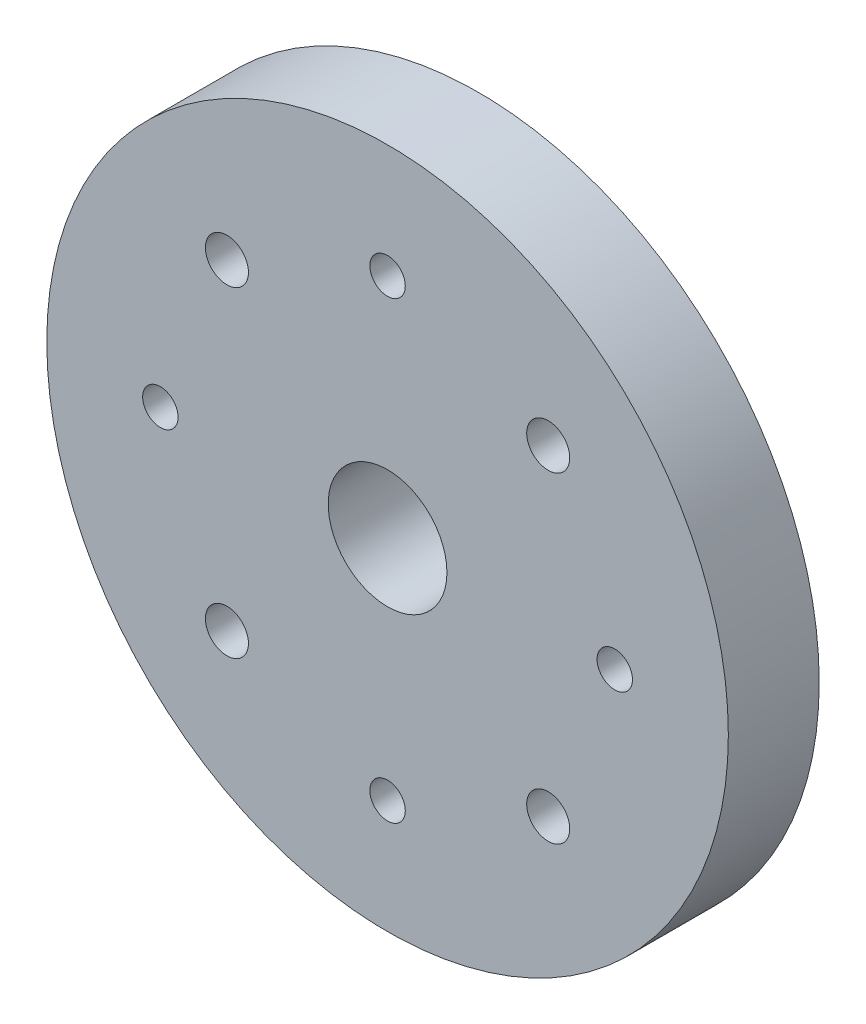
ISO-10303-21;
HEADER;
FILE_DESCRIPTION(('STEP AP214'),'2;1');
FILE_NAME('part.step','',(''),(''),'','','');
FILE_SCHEMA(('AUTOMOTIVE_DESIGN { 1 0 10303 214 1 1 1 1 }'));
ENDSEC;
DATA;
#1=APPLICATION_CONTEXT('core data for automotive mechanical design processes');
#2=APPLICATION_PROTOCOL_DEFINITION('international standard','automotive_design',2000,#1);
#3=PRODUCT_CONTEXT('',#1,'mechanical');
#4=PRODUCT('Part','Part','',(#3));
#5=PRODUCT_RELATED_PRODUCT_CATEGORY('part','',(#4));
#6=PRODUCT_DEFINITION_FORMATION('','',#4);
#7=PRODUCT_DEFINITION_CONTEXT('part definition',#1,'design');
#8=PRODUCT_DEFINITION('design','',#6,#7);
#9=PRODUCT_DEFINITION_SHAPE('','',#8);
#10=(LENGTH_UNIT() NAMED_UNIT(*) SI_UNIT(.MILLI.,.METRE.));
#11=(NAMED_UNIT(*) PLANE_ANGLE_UNIT() SI_UNIT($,.RADIAN.));
#12=(NAMED_UNIT(*) SI_UNIT($,.STERADIAN.) SOLID_ANGLE_UNIT());
#13=UNCERTAINTY_MEASURE_WITH_UNIT(LENGTH_MEASURE(1.E-05),#10,'distance_accuracy_value','');
#14=(GEOMETRIC_REPRESENTATION_CONTEXT(3) GLOBAL_UNCERTAINTY_ASSIGNED_CONTEXT((#13)) GLOBAL_UNIT_ASSIGNED_CONTEXT((#10,
#11,#12)) REPRESENTATION_CONTEXT('',''));
#15=CARTESIAN_POINT('',(0.,0.,0.));
#16=DIRECTION('',(0.,0.,1.));
#17=DIRECTION('',(1.,0.,0.));
#18=AXIS2_PLACEMENT_3D('',#15,#16,#17);
#19=CARTESIAN_POINT('',(0.,0.,6.));
#20=DIRECTION('',(0.,0.,1.));
#21=DIRECTION('',(1.,0.,0.));
#22=AXIS2_PLACEMENT_3D('',#19,#20,#21);
#23=PLANE('',#22);
#24=CARTESIAN_POINT('',(-15.,1.57116660247941E-13,6.));
#25=DIRECTION('',(0.,0.,1.));
#26=DIRECTION('',(1.,0.,0.));
#27=AXIS2_PLACEMENT_3D('',#24,#25,#26);
#28=CIRCLE('',#27,1.17);
#29=CARTESIAN_POINT('',(-13.83,1.57116660247941E-13,6.));
#30=VERTEX_POINT('',#29);
#31=EDGE_CURVE('E62',#30,#30,#28,.T.);
#32=ORIENTED_EDGE('',*,*,#31,.F.);
#33=EDGE_LOOP('',(#32));
#34=FACE_BOUND('',#33,.T.);
#35=CARTESIAN_POINT('',(3.48781665394082E-13,-15.0000000000002,6.));
#36=DIRECTION('',(0.,0.,1.));
#37=DIRECTION('',(1.,0.,0.));
#38=AXIS2_PLACEMENT_3D('',#35,#36,#37);
#39=CIRCLE('',#38,1.17);
#40=CARTESIAN_POINT('',(1.17000000000035,-15.0000000000002,6.));
#41=VERTEX_POINT('',#40);
#42=EDGE_CURVE('E74',#41,#41,#39,.T.);
#43=ORIENTED_EDGE('',*,*,#42,.F.);
#44=EDGE_LOOP('',(#43));
#45=FACE_BOUND('',#44,.T.);
#46=CARTESIAN_POINT('',(15.,0.,6.));
#47=DIRECTION('',(0.,0.,1.));
#48=DIRECTION('',(1.,0.,0.));
#49=AXIS2_PLACEMENT_3D('',#46,#47,#48);
#50=CIRCLE('',#49,1.17);
#51=CARTESIAN_POINT('',(16.17,0.,6.));
#52=VERTEX_POINT('',#51);
#53=EDGE_CURVE('E86',#52,#52,#50,.T.);
#54=ORIENTED_EDGE('',*,*,#53,.F.);
#55=EDGE_LOOP('',(#54));
#56=FACE_BOUND('',#55,.T.);
#57=CARTESIAN_POINT('',(0.,15.,6.));
#58=DIRECTION('',(0.,0.,1.));
#59=DIRECTION('',(1.,0.,0.));
#60=AXIS2_PLACEMENT_3D('',#57,#58,#59);
#61=CIRCLE('',#60,1.17);
#62=CARTESIAN_POINT('',(1.17,15.,6.));
#63=VERTEX_POINT('',#62);
#64=EDGE_CURVE('E54',#63,#63,#61,.T.);
#65=ORIENTED_EDGE('',*,*,#64,.F.);
#66=EDGE_LOOP('',(#65));
#67=FACE_BOUND('',#66,.T.);
#68=CARTESIAN_POINT('',(0.,0.,6.));
#69=DIRECTION('',(0.,0.,1.));
#70=DIRECTION('',(1.,0.,0.));
#71=AXIS2_PLACEMENT_3D('',#68,#69,#70);
#72=CIRCLE('',#71,22.5);
#73=CARTESIAN_POINT('',(22.5,0.,6.));
#74=VERTEX_POINT('',#73);
#75=EDGE_CURVE('E11',#74,#74,#72,.T.);
#76=ORIENTED_EDGE('',*,*,#75,.T.);
#77=EDGE_LOOP('',(#76));
#78=FACE_BOUND('',#77,.T.);
#79=CARTESIAN_POINT('',(0.,0.,6.));
#80=DIRECTION('',(0.,0.,1.));
#81=DIRECTION('',(1.,0.,0.));
#82=AXIS2_PLACEMENT_3D('',#79,#80,#81);
#83=CIRCLE('',#82,3.92);
#84=CARTESIAN_POINT('',(3.92,0.,6.));
#85=VERTEX_POINT('',#84);
#86=EDGE_CURVE('E46',#85,#85,#83,.T.);
#87=ORIENTED_EDGE('',*,*,#86,.F.);
#88=EDGE_LOOP('',(#87));
#89=FACE_BOUND('',#88,.T.);
#90=CARTESIAN_POINT('',(10.6066017177982,10.6066017177982,6.));
#91=DIRECTION('',(0.,0.,1.));
#92=DIRECTION('',(1.,0.,0.));
#93=AXIS2_PLACEMENT_3D('',#90,#91,#92);
#94=CIRCLE('',#93,1.42);
#95=CARTESIAN_POINT('',(12.0266017177982,10.6066017177982,6.));
#96=VERTEX_POINT('',#95);
#97=EDGE_CURVE('E92',#96,#96,#94,.T.);
#98=ORIENTED_EDGE('',*,*,#97,.F.);
#99=EDGE_LOOP('',(#98));
#100=FACE_BOUND('',#99,.T.);
#101=CARTESIAN_POINT('',(10.6066017177982,-10.6066017177983,6.));
#102=DIRECTION('',(0.,0.,1.));
#103=DIRECTION('',(1.,0.,0.));
#104=AXIS2_PLACEMENT_3D('',#101,#102,#103);
#105=CIRCLE('',#104,1.42);
#106=CARTESIAN_POINT('',(12.0266017177982,-10.6066017177983,6.));
#107=VERTEX_POINT('',#106);
#108=EDGE_CURVE('E80',#107,#107,#105,.T.);
#109=ORIENTED_EDGE('',*,*,#108,.F.);
#110=EDGE_LOOP('',(#109));
#111=FACE_BOUND('',#110,.T.);
#112=CARTESIAN_POINT('',(-10.6066017177979,-10.6066017177983,6.));
#113=DIRECTION('',(0.,0.,1.));
#114=DIRECTION('',(1.,0.,0.));
#115=AXIS2_PLACEMENT_3D('',#112,#113,#114);
#116=CIRCLE('',#115,1.42);
#117=CARTESIAN_POINT('',(-9.18660171779788,-10.6066017177983,6.));
#118=VERTEX_POINT('',#117);
#119=EDGE_CURVE('E68',#118,#118,#116,.T.);
#120=ORIENTED_EDGE('',*,*,#119,.F.);
#121=EDGE_LOOP('',(#120));
#122=FACE_BOUND('',#121,.T.);
#123=CARTESIAN_POINT('',(-10.6066017177981,10.6066017177983,6.));
#124=DIRECTION('',(0.,0.,1.));
#125=DIRECTION('',(1.,0.,0.));
#126=AXIS2_PLACEMENT_3D('',#123,#124,#125);
#127=CIRCLE('',#126,1.42);
#128=CARTESIAN_POINT('',(-9.18660171779808,10.6066017177983,6.));
#129=VERTEX_POINT('',#128);
#130=EDGE_CURVE('E55',#129,#129,#127,.T.);
#131=ORIENTED_EDGE('',*,*,#130,.F.);
#132=EDGE_LOOP('',(#131));
#133=FACE_BOUND('',#132,.T.);
#134=ADVANCED_FACE('F33',(#34,#45,#56,#67,#78,#89,#100,#111,#122,#133),#23,.T.);
#135=CARTESIAN_POINT('',(0.,0.,0.));
#136=DIRECTION('',(0.,0.,1.));
#137=DIRECTION('',(1.,0.,0.));
#138=AXIS2_PLACEMENT_3D('',#135,#136,#137);
#139=PLANE('',#138);
#140=CARTESIAN_POINT('',(-15.,1.57116660247941E-13,0.));
#141=DIRECTION('',(0.,0.,1.));
#142=DIRECTION('',(1.,0.,0.));
#143=AXIS2_PLACEMENT_3D('',#140,#141,#142);
#144=CIRCLE('',#143,1.17);
#145=CARTESIAN_POINT('',(-13.83,1.57116660247941E-13,0.));
#146=VERTEX_POINT('',#145);
#147=EDGE_CURVE('E58',#146,#146,#144,.T.);
#148=ORIENTED_EDGE('',*,*,#147,.T.);
#149=EDGE_LOOP('',(#148));
#150=FACE_BOUND('',#149,.T.);
#151=CARTESIAN_POINT('',(3.48781665394082E-13,-15.0000000000002,0.));
#152=DIRECTION('',(0.,0.,1.));
#153=DIRECTION('',(1.,0.,0.));
#154=AXIS2_PLACEMENT_3D('',#151,#152,#153);
#155=CIRCLE('',#154,1.17);
#156=CARTESIAN_POINT('',(1.17000000000035,-15.0000000000002,0.));
#157=VERTEX_POINT('',#156);
#158=EDGE_CURVE('E71',#157,#157,#155,.T.);
#159=ORIENTED_EDGE('',*,*,#158,.T.);
#160=EDGE_LOOP('',(#159));
#161=FACE_BOUND('',#160,.T.);
#162=CARTESIAN_POINT('',(15.,0.,0.));
#163=DIRECTION('',(0.,0.,1.));
#164=DIRECTION('',(1.,0.,0.));
#165=AXIS2_PLACEMENT_3D('',#162,#163,#164);
#166=CIRCLE('',#165,1.17);
#167=CARTESIAN_POINT('',(16.17,0.,0.));
#168=VERTEX_POINT('',#167);
#169=EDGE_CURVE('E83',#168,#168,#166,.T.);
#170=ORIENTED_EDGE('',*,*,#169,.T.);
#171=EDGE_LOOP('',(#170));
#172=FACE_BOUND('',#171,.T.);
#173=CARTESIAN_POINT('',(0.,15.,0.));
#174=DIRECTION('',(0.,0.,1.));
#175=DIRECTION('',(1.,0.,0.));
#176=AXIS2_PLACEMENT_3D('',#173,#174,#175);
#177=CIRCLE('',#176,1.17);
#178=CARTESIAN_POINT('',(1.17,15.,0.));
#179=VERTEX_POINT('',#178);
#180=EDGE_CURVE('E37',#179,#179,#177,.T.);
#181=ORIENTED_EDGE('',*,*,#180,.T.);
#182=EDGE_LOOP('',(#181));
#183=FACE_BOUND('',#182,.T.);
#184=CARTESIAN_POINT('',(0.,0.,0.));
#185=DIRECTION('',(0.,0.,1.));
#186=DIRECTION('',(1.,0.,0.));
#187=AXIS2_PLACEMENT_3D('',#184,#185,#186);
#188=CIRCLE('',#187,22.5);
#189=CARTESIAN_POINT('',(22.5,0.,0.));
#190=VERTEX_POINT('',#189);
#191=EDGE_CURVE('E41',#190,#190,#188,.T.);
#192=ORIENTED_EDGE('',*,*,#191,.F.);
#193=EDGE_LOOP('',(#192));
#194=FACE_BOUND('',#193,.T.);
#195=CARTESIAN_POINT('',(0.,0.,0.));
#196=DIRECTION('',(0.,0.,1.));
#197=DIRECTION('',(1.,0.,0.));
#198=AXIS2_PLACEMENT_3D('',#195,#196,#197);
#199=CIRCLE('',#198,3.92);
#200=CARTESIAN_POINT('',(3.92,0.,0.));
#201=VERTEX_POINT('',#200);
#202=EDGE_CURVE('E51',#201,#201,#199,.T.);
#203=ORIENTED_EDGE('',*,*,#202,.T.);
#204=EDGE_LOOP('',(#203));
#205=FACE_BOUND('',#204,.T.);
#206=CARTESIAN_POINT('',(10.6066017177982,10.6066017177982,0.));
#207=DIRECTION('',(0.,0.,1.));
#208=DIRECTION('',(1.,0.,0.));
#209=AXIS2_PLACEMENT_3D('',#206,#207,#208);
#210=CIRCLE('',#209,1.42);
#211=CARTESIAN_POINT('',(12.0266017177982,10.6066017177982,0.));
#212=VERTEX_POINT('',#211);
#213=EDGE_CURVE('E89',#212,#212,#210,.T.);
#214=ORIENTED_EDGE('',*,*,#213,.T.);
#215=EDGE_LOOP('',(#214));
#216=FACE_BOUND('',#215,.T.);
#217=CARTESIAN_POINT('',(10.6066017177982,-10.6066017177983,0.));
#218=DIRECTION('',(0.,0.,1.));
#219=DIRECTION('',(1.,0.,0.));
#220=AXIS2_PLACEMENT_3D('',#217,#218,#219);
#221=CIRCLE('',#220,1.42);
#222=CARTESIAN_POINT('',(12.0266017177982,-10.6066017177983,0.));
#223=VERTEX_POINT('',#222);
#224=EDGE_CURVE('E77',#223,#223,#221,.T.);
#225=ORIENTED_EDGE('',*,*,#224,.T.);
#226=EDGE_LOOP('',(#225));
#227=FACE_BOUND('',#226,.T.);
#228=CARTESIAN_POINT('',(-10.6066017177979,-10.6066017177983,0.));
#229=DIRECTION('',(0.,0.,1.));
#230=DIRECTION('',(1.,0.,0.));
#231=AXIS2_PLACEMENT_3D('',#228,#229,#230);
#232=CIRCLE('',#231,1.42);
#233=CARTESIAN_POINT('',(-9.18660171779788,-10.6066017177983,0.));
#234=VERTEX_POINT('',#233);
#235=EDGE_CURVE('E65',#234,#234,#232,.T.);
#236=ORIENTED_EDGE('',*,*,#235,.T.);
#237=EDGE_LOOP('',(#236));
#238=FACE_BOUND('',#237,.T.);
#239=CARTESIAN_POINT('',(-10.6066017177981,10.6066017177983,0.));
#240=DIRECTION('',(0.,0.,1.));
#241=DIRECTION('',(1.,0.,0.));
#242=AXIS2_PLACEMENT_3D('',#239,#240,#241);
#243=CIRCLE('',#242,1.42);
#244=CARTESIAN_POINT('',(-9.18660171779808,10.6066017177983,0.));
#245=VERTEX_POINT('',#244);
#246=EDGE_CURVE('E59',#245,#245,#243,.T.);
#247=ORIENTED_EDGE('',*,*,#246,.T.);
#248=EDGE_LOOP('',(#247));
#249=FACE_BOUND('',#248,.T.);
#250=ADVANCED_FACE('F102',(#150,#161,#172,#183,#194,#205,#216,#227,#238,#249),#139,.F.);
#251=CARTESIAN_POINT('',(0.,0.,6.));
#252=DIRECTION('',(0.,0.,-1.));
#253=DIRECTION('',(-1.,0.,0.));
#254=AXIS2_PLACEMENT_3D('',#251,#252,#253);
#255=CYLINDRICAL_SURFACE('',#254,22.5);
#256=ORIENTED_EDGE('',*,*,#75,.F.);
#257=EDGE_LOOP('',(#256));
#258=FACE_BOUND('',#257,.T.);
#259=ORIENTED_EDGE('',*,*,#191,.T.);
#260=EDGE_LOOP('',(#259));
#261=FACE_BOUND('',#260,.T.);
#262=ADVANCED_FACE('F117',(#258,#261),#255,.T.);
#263=CARTESIAN_POINT('',(0.,0.,6.));
#264=DIRECTION('',(0.,0.,-1.));
#265=DIRECTION('',(-1.,0.,0.));
#266=AXIS2_PLACEMENT_3D('',#263,#264,#265);
#267=CYLINDRICAL_SURFACE('',#266,3.92);
#268=ORIENTED_EDGE('',*,*,#86,.T.);
#269=EDGE_LOOP('',(#268));
#270=FACE_BOUND('',#269,.T.);
#271=ORIENTED_EDGE('',*,*,#202,.F.);
#272=EDGE_LOOP('',(#271));
#273=FACE_BOUND('',#272,.T.);
#274=ADVANCED_FACE('F108',(#270,#273),#267,.F.);
#275=CARTESIAN_POINT('',(0.,15.,6.));
#276=DIRECTION('',(0.,0.,-1.));
#277=DIRECTION('',(-1.,0.,0.));
#278=AXIS2_PLACEMENT_3D('',#275,#276,#277);
#279=CYLINDRICAL_SURFACE('',#278,1.17);
#280=ORIENTED_EDGE('',*,*,#64,.T.);
#281=EDGE_LOOP('',(#280));
#282=FACE_BOUND('',#281,.T.);
#283=ORIENTED_EDGE('',*,*,#180,.F.);
#284=EDGE_LOOP('',(#283));
#285=FACE_BOUND('',#284,.T.);
#286=ADVANCED_FACE('F105',(#282,#285),#279,.F.);
#287=CARTESIAN_POINT('',(10.6066017177982,10.6066017177982,6.));
#288=DIRECTION('',(0.,0.,-1.));
#289=DIRECTION('',(-1.,0.,0.));
#290=AXIS2_PLACEMENT_3D('',#287,#288,#289);
#291=CYLINDRICAL_SURFACE('',#290,1.42);
#292=ORIENTED_EDGE('',*,*,#97,.T.);
#293=EDGE_LOOP('',(#292));
#294=FACE_BOUND('',#293,.T.);
#295=ORIENTED_EDGE('',*,*,#213,.F.);
#296=EDGE_LOOP('',(#295));
#297=FACE_BOUND('',#296,.T.);
#298=ADVANCED_FACE('F107',(#294,#297),#291,.F.);
#299=CARTESIAN_POINT('',(15.,0.,6.));
#300=DIRECTION('',(0.,0.,-1.));
#301=DIRECTION('',(-1.,0.,0.));
#302=AXIS2_PLACEMENT_3D('',#299,#300,#301);
#303=CYLINDRICAL_SURFACE('',#302,1.17);
#304=ORIENTED_EDGE('',*,*,#53,.T.);
#305=EDGE_LOOP('',(#304));
#306=FACE_BOUND('',#305,.T.);
#307=ORIENTED_EDGE('',*,*,#169,.F.);
#308=EDGE_LOOP('',(#307));
#309=FACE_BOUND('',#308,.T.);
#310=ADVANCED_FACE('F114',(#306,#309),#303,.F.);
#311=CARTESIAN_POINT('',(10.6066017177982,-10.6066017177983,6.));
#312=DIRECTION('',(0.,0.,-1.));
#313=DIRECTION('',(-1.,0.,0.));
#314=AXIS2_PLACEMENT_3D('',#311,#312,#313);
#315=CYLINDRICAL_SURFACE('',#314,1.42);
#316=ORIENTED_EDGE('',*,*,#108,.T.);
#317=EDGE_LOOP('',(#316));
#318=FACE_BOUND('',#317,.T.);
#319=ORIENTED_EDGE('',*,*,#224,.F.);
#320=EDGE_LOOP('',(#319));
#321=FACE_BOUND('',#320,.T.);
#322=ADVANCED_FACE('F168',(#318,#321),#315,.F.);
#323=CARTESIAN_POINT('',(3.48781665394082E-13,-15.0000000000002,6.));
#324=DIRECTION('',(0.,0.,-1.));
#325=DIRECTION('',(-1.,0.,0.));
#326=AXIS2_PLACEMENT_3D('',#323,#324,#325);
#327=CYLINDRICAL_SURFACE('',#326,1.17);
#328=ORIENTED_EDGE('',*,*,#42,.T.);
#329=EDGE_LOOP('',(#328));
#330=FACE_BOUND('',#329,.T.);
#331=ORIENTED_EDGE('',*,*,#158,.F.);
#332=EDGE_LOOP('',(#331));
#333=FACE_BOUND('',#332,.T.);
#334=ADVANCED_FACE('F161',(#330,#333),#327,.F.);
#335=CARTESIAN_POINT('',(-10.6066017177979,-10.6066017177983,6.));
#336=DIRECTION('',(0.,0.,-1.));
#337=DIRECTION('',(-1.,0.,0.));
#338=AXIS2_PLACEMENT_3D('',#335,#336,#337);
#339=CYLINDRICAL_SURFACE('',#338,1.42);
#340=ORIENTED_EDGE('',*,*,#119,.T.);
#341=EDGE_LOOP('',(#340));
#342=FACE_BOUND('',#341,.T.);
#343=ORIENTED_EDGE('',*,*,#235,.F.);
#344=EDGE_LOOP('',(#343));
#345=FACE_BOUND('',#344,.T.);
#346=ADVANCED_FACE('F154',(#342,#345),#339,.F.);
#347=CARTESIAN_POINT('',(-15.,1.57116660247941E-13,6.));
#348=DIRECTION('',(0.,0.,-1.));
#349=DIRECTION('',(-1.,0.,0.));
#350=AXIS2_PLACEMENT_3D('',#347,#348,#349);
#351=CYLINDRICAL_SURFACE('',#350,1.17);
#352=ORIENTED_EDGE('',*,*,#31,.T.);
#353=EDGE_LOOP('',(#352));
#354=FACE_BOUND('',#353,.T.);
#355=ORIENTED_EDGE('',*,*,#147,.F.);
#356=EDGE_LOOP('',(#355));
#357=FACE_BOUND('',#356,.T.);
#358=ADVANCED_FACE('F149',(#354,#357),#351,.F.);
#359=CARTESIAN_POINT('',(-10.6066017177981,10.6066017177983,6.));
#360=DIRECTION('',(0.,0.,-1.));
#361=DIRECTION('',(-1.,0.,0.));
#362=AXIS2_PLACEMENT_3D('',#359,#360,#361);
#363=CYLINDRICAL_SURFACE('',#362,1.42);
#364=ORIENTED_EDGE('',*,*,#130,.T.);
#365=EDGE_LOOP('',(#364));
#366=FACE_BOUND('',#365,.T.);
#367=ORIENTED_EDGE('',*,*,#246,.F.);
#368=EDGE_LOOP('',(#367));
#369=FACE_BOUND('',#368,.T.);
#370=ADVANCED_FACE('F35',(#366,#369),#363,.F.);
#371=CLOSED_SHELL('',(#134,#250,#262,#274,#286,#298,#310,#322,#334,#346,#358,#370));
#372=MANIFOLD_SOLID_BREP('B2',#371);
#373=ADVANCED_BREP_SHAPE_REPRESENTATION('',(#18,#372),#14);
#374=SHAPE_DEFINITION_REPRESENTATION(#9,#373);
ENDSEC;
END-ISO-10303-21;
